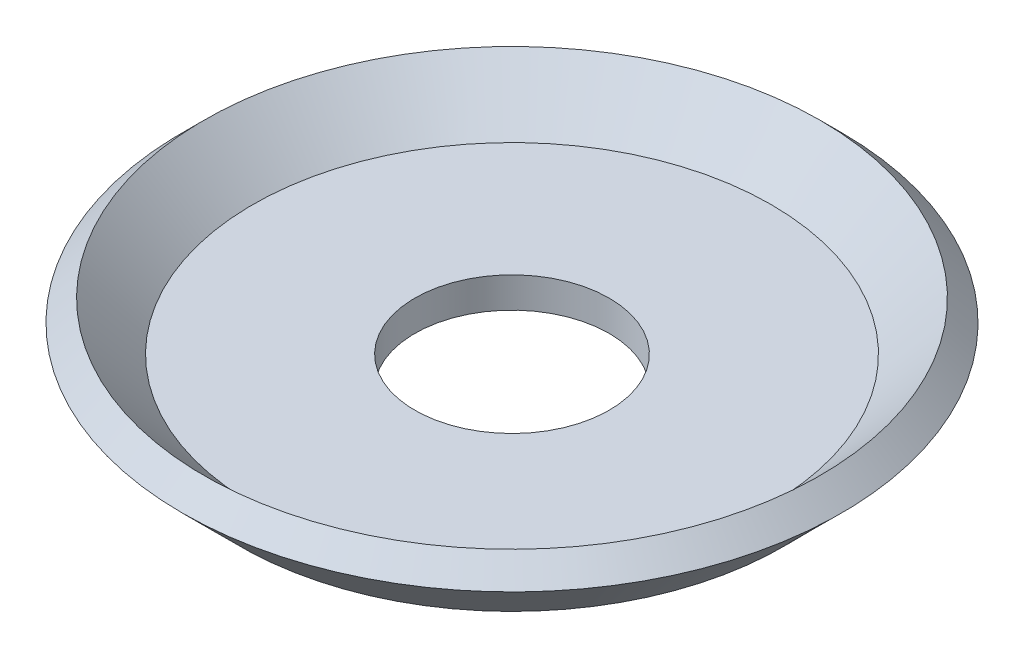
ISO-10303-21;
HEADER;
FILE_DESCRIPTION(('STEP AP214'),'2;1');
FILE_NAME('part.step','',(''),(''),'','','');
FILE_SCHEMA(('AUTOMOTIVE_DESIGN { 1 0 10303 214 1 1 1 1 }'));
ENDSEC;
DATA;
#1=APPLICATION_CONTEXT('core data for automotive mechanical design processes');
#2=APPLICATION_PROTOCOL_DEFINITION('international standard','automotive_design',2000,#1);
#3=PRODUCT_CONTEXT('',#1,'mechanical');
#4=PRODUCT('Part','Part','',(#3));
#5=PRODUCT_RELATED_PRODUCT_CATEGORY('part','',(#4));
#6=PRODUCT_DEFINITION_FORMATION('','',#4);
#7=PRODUCT_DEFINITION_CONTEXT('part definition',#1,'design');
#8=PRODUCT_DEFINITION('design','',#6,#7);
#9=PRODUCT_DEFINITION_SHAPE('','',#8);
#10=(LENGTH_UNIT() NAMED_UNIT(*) SI_UNIT(.MILLI.,.METRE.));
#11=(NAMED_UNIT(*) PLANE_ANGLE_UNIT() SI_UNIT($,.RADIAN.));
#12=(NAMED_UNIT(*) SI_UNIT($,.STERADIAN.) SOLID_ANGLE_UNIT());
#13=UNCERTAINTY_MEASURE_WITH_UNIT(LENGTH_MEASURE(1.E-05),#10,'distance_accuracy_value','');
#14=(GEOMETRIC_REPRESENTATION_CONTEXT(3) GLOBAL_UNCERTAINTY_ASSIGNED_CONTEXT((#13)) GLOBAL_UNIT_ASSIGNED_CONTEXT((#10,
#11,#12)) REPRESENTATION_CONTEXT('',''));
#15=CARTESIAN_POINT('',(0.,0.,0.));
#16=DIRECTION('',(0.,0.,1.));
#17=DIRECTION('',(1.,0.,0.));
#18=AXIS2_PLACEMENT_3D('',#15,#16,#17);
#19=CARTESIAN_POINT('',(0.,0.,0.));
#20=DIRECTION('',(0.,-1.,0.));
#21=DIRECTION('',(0.,0.,-1.));
#22=AXIS2_PLACEMENT_3D('',#19,#20,#21);
#23=CYLINDRICAL_SURFACE('',#22,4.7625);
#24=CARTESIAN_POINT('',(0.,1.5,0.));
#25=DIRECTION('',(0.,-1.,0.));
#26=DIRECTION('',(0.,0.,-1.));
#27=AXIS2_PLACEMENT_3D('',#24,#25,#26);
#28=CIRCLE('',#27,4.7625);
#29=CARTESIAN_POINT('',(0.,1.5,-4.7625));
#30=VERTEX_POINT('',#29);
#31=EDGE_CURVE('E64',#30,#30,#28,.T.);
#32=ORIENTED_EDGE('',*,*,#31,.F.);
#33=EDGE_LOOP('',(#32));
#34=FACE_BOUND('',#33,.T.);
#35=CARTESIAN_POINT('',(0.,0.,0.));
#36=DIRECTION('',(0.,-1.,0.));
#37=DIRECTION('',(0.,0.,-1.));
#38=AXIS2_PLACEMENT_3D('',#35,#36,#37);
#39=CIRCLE('',#38,4.7625);
#40=CARTESIAN_POINT('',(0.,0.,-4.7625));
#41=VERTEX_POINT('',#40);
#42=EDGE_CURVE('E10',#41,#41,#39,.T.);
#43=ORIENTED_EDGE('',*,*,#42,.T.);
#44=EDGE_LOOP('',(#43));
#45=FACE_BOUND('',#44,.T.);
#46=ADVANCED_FACE('F37',(#34,#45),#23,.F.);
#47=CARTESIAN_POINT('',(0.,0.,4.7625));
#48=DIRECTION('',(0.,1.,0.));
#49=DIRECTION('',(0.,0.,1.));
#50=AXIS2_PLACEMENT_3D('',#47,#48,#49);
#51=PLANE('',#50);
#52=ORIENTED_EDGE('',*,*,#42,.F.);
#53=EDGE_LOOP('',(#52));
#54=FACE_BOUND('',#53,.T.);
#55=CARTESIAN_POINT('',(0.,0.,0.));
#56=DIRECTION('',(0.,-1.,0.));
#57=DIRECTION('',(0.,0.,-1.));
#58=AXIS2_PLACEMENT_3D('',#55,#56,#57);
#59=CIRCLE('',#58,13.3213203435596);
#60=CARTESIAN_POINT('',(0.,0.,-13.3213203435596));
#61=VERTEX_POINT('',#60);
#62=EDGE_CURVE('E44',#61,#61,#59,.T.);
#63=ORIENTED_EDGE('',*,*,#62,.T.);
#64=EDGE_LOOP('',(#63));
#65=FACE_BOUND('',#64,.T.);
#66=ADVANCED_FACE('F72',(#54,#65),#51,.F.);
#67=CARTESIAN_POINT('',(0.,2.82842712474619,0.));
#68=DIRECTION('',(0.,1.,0.));
#69=DIRECTION('',(0.,0.,1.));
#70=AXIS2_PLACEMENT_3D('',#67,#68,#69);
#71=CONICAL_SURFACE('',#70,16.1497474683058,0.785398163397447);
#72=ORIENTED_EDGE('',*,*,#62,.F.);
#73=EDGE_LOOP('',(#72));
#74=FACE_BOUND('',#73,.T.);
#75=CARTESIAN_POINT('',(0.,2.82842712474619,0.));
#76=DIRECTION('',(0.,-1.,0.));
#77=DIRECTION('',(0.,0.,-1.));
#78=AXIS2_PLACEMENT_3D('',#75,#76,#77);
#79=CIRCLE('',#78,16.1497474683058);
#80=CARTESIAN_POINT('',(0.,2.82842712474619,-16.1497474683058));
#81=VERTEX_POINT('',#80);
#82=EDGE_CURVE('E49',#81,#81,#79,.T.);
#83=ORIENTED_EDGE('',*,*,#82,.T.);
#84=EDGE_LOOP('',(#83));
#85=FACE_BOUND('',#84,.T.);
#86=ADVANCED_FACE('F76',(#74,#85),#71,.T.);
#87=CARTESIAN_POINT('',(0.,3.88908729652601,0.));
#88=DIRECTION('',(0.,-1.,0.));
#89=DIRECTION('',(0.,0.,-1.));
#90=AXIS2_PLACEMENT_3D('',#87,#88,#89);
#91=CONICAL_SURFACE('',#90,15.089087296526,0.785398163397448);
#92=ORIENTED_EDGE('',*,*,#82,.F.);
#93=EDGE_LOOP('',(#92));
#94=FACE_BOUND('',#93,.T.);
#95=CARTESIAN_POINT('',(0.,3.88908729652601,0.));
#96=DIRECTION('',(0.,-1.,0.));
#97=DIRECTION('',(0.,0.,-1.));
#98=AXIS2_PLACEMENT_3D('',#95,#96,#97);
#99=CIRCLE('',#98,15.089087296526);
#100=CARTESIAN_POINT('',(0.,3.88908729652601,-15.089087296526));
#101=VERTEX_POINT('',#100);
#102=EDGE_CURVE('E54',#101,#101,#99,.T.);
#103=ORIENTED_EDGE('',*,*,#102,.T.);
#104=EDGE_LOOP('',(#103));
#105=FACE_BOUND('',#104,.T.);
#106=ADVANCED_FACE('F81',(#94,#105),#91,.T.);
#107=CARTESIAN_POINT('',(0.,1.5,0.));
#108=DIRECTION('',(0.,1.,0.));
#109=DIRECTION('',(0.,0.,1.));
#110=AXIS2_PLACEMENT_3D('',#107,#108,#109);
#111=CONICAL_SURFACE('',#110,12.7,0.785398163397446);
#112=ORIENTED_EDGE('',*,*,#102,.F.);
#113=EDGE_LOOP('',(#112));
#114=FACE_BOUND('',#113,.T.);
#115=CARTESIAN_POINT('',(0.,1.5,0.));
#116=DIRECTION('',(0.,-1.,0.));
#117=DIRECTION('',(0.,0.,-1.));
#118=AXIS2_PLACEMENT_3D('',#115,#116,#117);
#119=CIRCLE('',#118,12.7);
#120=CARTESIAN_POINT('',(0.,1.5,-12.7));
#121=VERTEX_POINT('',#120);
#122=EDGE_CURVE('E60',#121,#121,#119,.T.);
#123=ORIENTED_EDGE('',*,*,#122,.T.);
#124=EDGE_LOOP('',(#123));
#125=FACE_BOUND('',#124,.T.);
#126=ADVANCED_FACE('F87',(#114,#125),#111,.F.);
#127=CARTESIAN_POINT('',(0.,1.5,12.7));
#128=DIRECTION('',(0.,-1.,0.));
#129=DIRECTION('',(0.,0.,-1.));
#130=AXIS2_PLACEMENT_3D('',#127,#128,#129);
#131=PLANE('',#130);
#132=ORIENTED_EDGE('',*,*,#122,.F.);
#133=EDGE_LOOP('',(#132));
#134=FACE_BOUND('',#133,.T.);
#135=ORIENTED_EDGE('',*,*,#31,.T.);
#136=EDGE_LOOP('',(#135));
#137=FACE_BOUND('',#136,.T.);
#138=ADVANCED_FACE('F69',(#134,#137),#131,.F.);
#139=CLOSED_SHELL('',(#46,#66,#86,#106,#126,#138));
#140=MANIFOLD_SOLID_BREP('B2',#139);
#141=ADVANCED_BREP_SHAPE_REPRESENTATION('',(#18,#140),#14);
#142=SHAPE_DEFINITION_REPRESENTATION(#9,#141);
ENDSEC;
END-ISO-10303-21;
